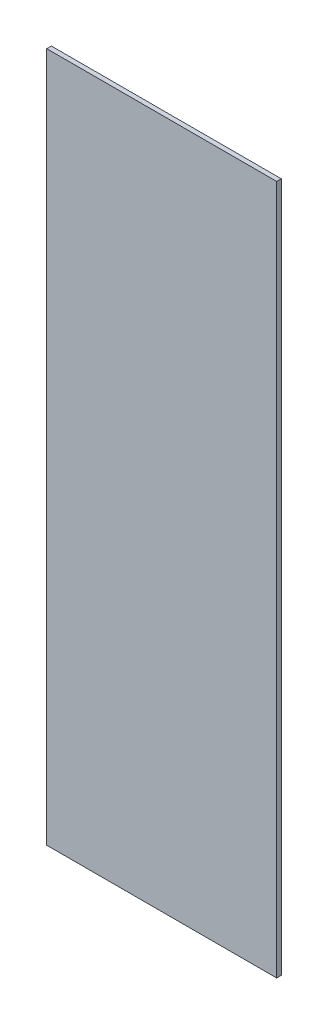
ISO-10303-21;
HEADER;
FILE_DESCRIPTION(('STEP AP214'),'2;1');
FILE_NAME('part.step','',(''),(''),'','','');
FILE_SCHEMA(('AUTOMOTIVE_DESIGN { 1 0 10303 214 1 1 1 1 }'));
ENDSEC;
DATA;
#1=APPLICATION_CONTEXT('core data for automotive mechanical design processes');
#2=APPLICATION_PROTOCOL_DEFINITION('international standard','automotive_design',2000,#1);
#3=PRODUCT_CONTEXT('',#1,'mechanical');
#4=PRODUCT('Part','Part','',(#3));
#5=PRODUCT_RELATED_PRODUCT_CATEGORY('part','',(#4));
#6=PRODUCT_DEFINITION_FORMATION('','',#4);
#7=PRODUCT_DEFINITION_CONTEXT('part definition',#1,'design');
#8=PRODUCT_DEFINITION('design','',#6,#7);
#9=PRODUCT_DEFINITION_SHAPE('','',#8);
#10=(LENGTH_UNIT() NAMED_UNIT(*) SI_UNIT(.MILLI.,.METRE.));
#11=(NAMED_UNIT(*) PLANE_ANGLE_UNIT() SI_UNIT($,.RADIAN.));
#12=(NAMED_UNIT(*) SI_UNIT($,.STERADIAN.) SOLID_ANGLE_UNIT());
#13=UNCERTAINTY_MEASURE_WITH_UNIT(LENGTH_MEASURE(1.E-05),#10,'distance_accuracy_value','');
#14=(GEOMETRIC_REPRESENTATION_CONTEXT(3) GLOBAL_UNCERTAINTY_ASSIGNED_CONTEXT((#13)) GLOBAL_UNIT_ASSIGNED_CONTEXT((#10,
#11,#12)) REPRESENTATION_CONTEXT('',''));
#15=CARTESIAN_POINT('',(0.,0.,0.));
#16=DIRECTION('',(0.,0.,1.));
#17=DIRECTION('',(1.,0.,0.));
#18=AXIS2_PLACEMENT_3D('',#15,#16,#17);
#19=CARTESIAN_POINT('',(0.,0.,2.));
#20=DIRECTION('',(1.,0.,0.));
#21=DIRECTION('',(0.,1.,0.));
#22=AXIS2_PLACEMENT_3D('',#19,#20,#21);
#23=PLANE('',#22);
#24=DIRECTION('',(0.,-1.,0.));
#25=VECTOR('',#24,1.);
#26=CARTESIAN_POINT('',(0.,0.,0.));
#27=LINE('',#26,#25);
#28=CARTESIAN_POINT('',(0.,0.,0.));
#29=VERTEX_POINT('',#28);
#30=CARTESIAN_POINT('',(0.,-300.,0.));
#31=VERTEX_POINT('',#30);
#32=EDGE_CURVE('E100',#29,#31,#27,.T.);
#33=ORIENTED_EDGE('',*,*,#32,.T.);
#34=DIRECTION('',(0.,0.,-1.));
#35=VECTOR('',#34,1.);
#36=CARTESIAN_POINT('',(0.,-300.,2.));
#37=LINE('',#36,#35);
#38=CARTESIAN_POINT('',(0.,-300.,2.));
#39=VERTEX_POINT('',#38);
#40=EDGE_CURVE('E11',#39,#31,#37,.T.);
#41=ORIENTED_EDGE('',*,*,#40,.F.);
#42=DIRECTION('',(0.,-1.,0.));
#43=VECTOR('',#42,1.);
#44=CARTESIAN_POINT('',(0.,0.,2.));
#45=LINE('',#44,#43);
#46=CARTESIAN_POINT('',(0.,0.,2.));
#47=VERTEX_POINT('',#46);
#48=EDGE_CURVE('E88',#47,#39,#45,.T.);
#49=ORIENTED_EDGE('',*,*,#48,.F.);
#50=DIRECTION('',(0.,0.,-1.));
#51=VECTOR('',#50,1.);
#52=CARTESIAN_POINT('',(0.,0.,2.));
#53=LINE('',#52,#51);
#54=EDGE_CURVE('E96',#47,#29,#53,.T.);
#55=ORIENTED_EDGE('',*,*,#54,.T.);
#56=EDGE_LOOP('',(#33,#41,#49,#55));
#57=FACE_BOUND('',#56,.T.);
#58=ADVANCED_FACE('F37',(#57),#23,.F.);
#59=CARTESIAN_POINT('',(0.,-300.,2.));
#60=DIRECTION('',(0.,1.,0.));
#61=DIRECTION('',(0.,0.,1.));
#62=AXIS2_PLACEMENT_3D('',#59,#60,#61);
#63=PLANE('',#62);
#64=DIRECTION('',(1.,0.,0.));
#65=VECTOR('',#64,1.);
#66=CARTESIAN_POINT('',(0.,-300.,0.));
#67=LINE('',#66,#65);
#68=CARTESIAN_POINT('',(100.,-300.,0.));
#69=VERTEX_POINT('',#68);
#70=EDGE_CURVE('E92',#31,#69,#67,.T.);
#71=ORIENTED_EDGE('',*,*,#70,.T.);
#72=DIRECTION('',(0.,0.,-1.));
#73=VECTOR('',#72,1.);
#74=CARTESIAN_POINT('',(100.,-300.,2.));
#75=LINE('',#74,#73);
#76=CARTESIAN_POINT('',(100.,-300.,2.));
#77=VERTEX_POINT('',#76);
#78=EDGE_CURVE('E45',#77,#69,#75,.T.);
#79=ORIENTED_EDGE('',*,*,#78,.F.);
#80=DIRECTION('',(1.,0.,0.));
#81=VECTOR('',#80,1.);
#82=CARTESIAN_POINT('',(0.,-300.,2.));
#83=LINE('',#82,#81);
#84=EDGE_CURVE('E83',#39,#77,#83,.T.);
#85=ORIENTED_EDGE('',*,*,#84,.F.);
#86=ORIENTED_EDGE('',*,*,#40,.T.);
#87=EDGE_LOOP('',(#71,#79,#85,#86));
#88=FACE_BOUND('',#87,.T.);
#89=ADVANCED_FACE('F91',(#88),#63,.F.);
#90=CARTESIAN_POINT('',(100.,0.,2.));
#91=DIRECTION('',(-1.,0.,0.));
#92=DIRECTION('',(0.,-1.,0.));
#93=AXIS2_PLACEMENT_3D('',#90,#91,#92);
#94=PLANE('',#93);
#95=DIRECTION('',(0.,1.,0.));
#96=VECTOR('',#95,1.);
#97=CARTESIAN_POINT('',(100.,0.,0.));
#98=LINE('',#97,#96);
#99=CARTESIAN_POINT('',(100.,0.,0.));
#100=VERTEX_POINT('',#99);
#101=EDGE_CURVE('E70',#69,#100,#98,.T.);
#102=ORIENTED_EDGE('',*,*,#101,.T.);
#103=DIRECTION('',(0.,0.,-1.));
#104=VECTOR('',#103,1.);
#105=CARTESIAN_POINT('',(100.,0.,2.));
#106=LINE('',#105,#104);
#107=CARTESIAN_POINT('',(100.,0.,2.));
#108=VERTEX_POINT('',#107);
#109=EDGE_CURVE('E93',#108,#100,#106,.T.);
#110=ORIENTED_EDGE('',*,*,#109,.F.);
#111=DIRECTION('',(0.,1.,0.));
#112=VECTOR('',#111,1.);
#113=CARTESIAN_POINT('',(100.,0.,2.));
#114=LINE('',#113,#112);
#115=EDGE_CURVE('E86',#77,#108,#114,.T.);
#116=ORIENTED_EDGE('',*,*,#115,.F.);
#117=ORIENTED_EDGE('',*,*,#78,.T.);
#118=EDGE_LOOP('',(#102,#110,#116,#117));
#119=FACE_BOUND('',#118,.T.);
#120=ADVANCED_FACE('F94',(#119),#94,.F.);
#121=CARTESIAN_POINT('',(0.,0.,2.));
#122=DIRECTION('',(0.,-1.,0.));
#123=DIRECTION('',(0.,0.,-1.));
#124=AXIS2_PLACEMENT_3D('',#121,#122,#123);
#125=PLANE('',#124);
#126=DIRECTION('',(-1.,0.,0.));
#127=VECTOR('',#126,1.);
#128=CARTESIAN_POINT('',(0.,0.,0.));
#129=LINE('',#128,#127);
#130=EDGE_CURVE('E76',#100,#29,#129,.T.);
#131=ORIENTED_EDGE('',*,*,#130,.T.);
#132=ORIENTED_EDGE('',*,*,#54,.F.);
#133=DIRECTION('',(-1.,0.,0.));
#134=VECTOR('',#133,1.);
#135=CARTESIAN_POINT('',(0.,0.,2.));
#136=LINE('',#135,#134);
#137=EDGE_CURVE('E53',#108,#47,#136,.T.);
#138=ORIENTED_EDGE('',*,*,#137,.F.);
#139=ORIENTED_EDGE('',*,*,#109,.T.);
#140=EDGE_LOOP('',(#131,#132,#138,#139));
#141=FACE_BOUND('',#140,.T.);
#142=ADVANCED_FACE('F107',(#141),#125,.F.);
#143=CARTESIAN_POINT('',(0.,0.,2.));
#144=DIRECTION('',(0.,0.,1.));
#145=DIRECTION('',(1.,0.,0.));
#146=AXIS2_PLACEMENT_3D('',#143,#144,#145);
#147=PLANE('',#146);
#148=ORIENTED_EDGE('',*,*,#48,.T.);
#149=ORIENTED_EDGE('',*,*,#84,.T.);
#150=ORIENTED_EDGE('',*,*,#115,.T.);
#151=ORIENTED_EDGE('',*,*,#137,.T.);
#152=EDGE_LOOP('',(#148,#149,#150,#151));
#153=FACE_BOUND('',#152,.T.);
#154=ADVANCED_FACE('F84',(#153),#147,.T.);
#155=CARTESIAN_POINT('',(0.,0.,0.));
#156=DIRECTION('',(0.,0.,1.));
#157=DIRECTION('',(1.,0.,0.));
#158=AXIS2_PLACEMENT_3D('',#155,#156,#157);
#159=PLANE('',#158);
#160=ORIENTED_EDGE('',*,*,#32,.F.);
#161=ORIENTED_EDGE('',*,*,#130,.F.);
#162=ORIENTED_EDGE('',*,*,#101,.F.);
#163=ORIENTED_EDGE('',*,*,#70,.F.);
#164=EDGE_LOOP('',(#160,#161,#162,#163));
#165=FACE_BOUND('',#164,.T.);
#166=ADVANCED_FACE('F110',(#165),#159,.F.);
#167=CLOSED_SHELL('',(#58,#89,#120,#142,#154,#166));
#168=MANIFOLD_SOLID_BREP('B2',#167);
#169=ADVANCED_BREP_SHAPE_REPRESENTATION('',(#18,#168),#14);
#170=SHAPE_DEFINITION_REPRESENTATION(#9,#169);
ENDSEC;
END-ISO-10303-21;
